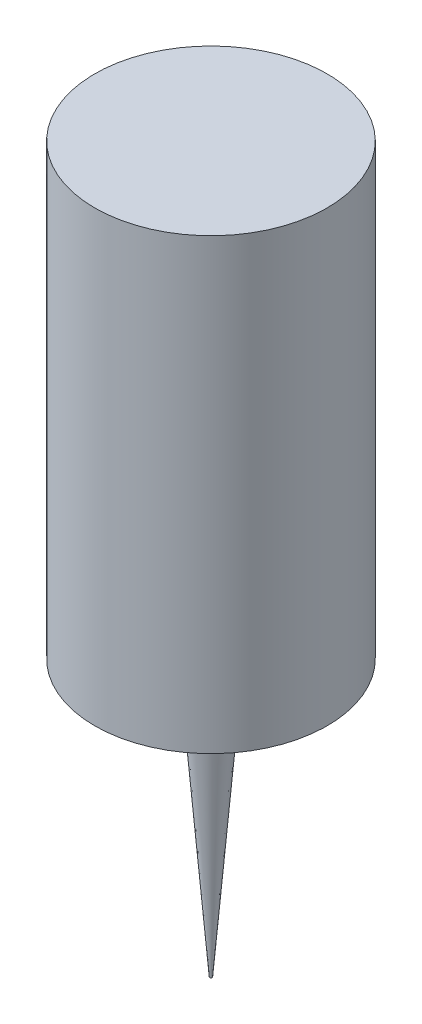
ISO-10303-21;
HEADER;
FILE_DESCRIPTION(('STEP AP214'),'2;1');
FILE_NAME('part.step','',(''),(''),'','','');
FILE_SCHEMA(('AUTOMOTIVE_DESIGN { 1 0 10303 214 1 1 1 1 }'));
ENDSEC;
DATA;
#1=APPLICATION_CONTEXT('core data for automotive mechanical design processes');
#2=APPLICATION_PROTOCOL_DEFINITION('international standard','automotive_design',2000,#1);
#3=PRODUCT_CONTEXT('',#1,'mechanical');
#4=PRODUCT('Part','Part','',(#3));
#5=PRODUCT_RELATED_PRODUCT_CATEGORY('part','',(#4));
#6=PRODUCT_DEFINITION_FORMATION('','',#4);
#7=PRODUCT_DEFINITION_CONTEXT('part definition',#1,'design');
#8=PRODUCT_DEFINITION('design','',#6,#7);
#9=PRODUCT_DEFINITION_SHAPE('','',#8);
#10=(LENGTH_UNIT() NAMED_UNIT(*) SI_UNIT(.MILLI.,.METRE.));
#11=(NAMED_UNIT(*) PLANE_ANGLE_UNIT() SI_UNIT($,.RADIAN.));
#12=(NAMED_UNIT(*) SI_UNIT($,.STERADIAN.) SOLID_ANGLE_UNIT());
#13=UNCERTAINTY_MEASURE_WITH_UNIT(LENGTH_MEASURE(1.E-05),#10,'distance_accuracy_value','');
#14=(GEOMETRIC_REPRESENTATION_CONTEXT(3) GLOBAL_UNCERTAINTY_ASSIGNED_CONTEXT((#13)) GLOBAL_UNIT_ASSIGNED_CONTEXT((#10,
#11,#12)) REPRESENTATION_CONTEXT('',''));
#15=CARTESIAN_POINT('',(0.,0.,0.));
#16=DIRECTION('',(0.,0.,1.));
#17=DIRECTION('',(1.,0.,0.));
#18=AXIS2_PLACEMENT_3D('',#15,#16,#17);
#19=CARTESIAN_POINT('',(0.,9.8044,0.));
#20=DIRECTION('',(0.,-1.,0.));
#21=DIRECTION('',(0.,0.,-1.));
#22=AXIS2_PLACEMENT_3D('',#19,#20,#21);
#23=CYLINDRICAL_SURFACE('',#22,2.54);
#24=CARTESIAN_POINT('',(0.,9.8044,0.));
#25=DIRECTION('',(0.,1.,0.));
#26=DIRECTION('',(0.,0.,1.));
#27=AXIS2_PLACEMENT_3D('',#24,#25,#26);
#28=CIRCLE('',#27,2.54);
#29=CARTESIAN_POINT('',(0.,9.8044,2.54));
#30=VERTEX_POINT('',#29);
#31=EDGE_CURVE('E10',#30,#30,#28,.T.);
#32=ORIENTED_EDGE('',*,*,#31,.F.);
#33=EDGE_LOOP('',(#32));
#34=FACE_BOUND('',#33,.T.);
#35=CARTESIAN_POINT('',(0.,0.,0.));
#36=DIRECTION('',(0.,1.,0.));
#37=DIRECTION('',(0.,0.,1.));
#38=AXIS2_PLACEMENT_3D('',#35,#36,#37);
#39=CIRCLE('',#38,2.54);
#40=CARTESIAN_POINT('',(0.,0.,2.54));
#41=VERTEX_POINT('',#40);
#42=EDGE_CURVE('E40',#41,#41,#39,.T.);
#43=ORIENTED_EDGE('',*,*,#42,.T.);
#44=EDGE_LOOP('',(#43));
#45=FACE_BOUND('',#44,.T.);
#46=ADVANCED_FACE('F37',(#34,#45),#23,.T.);
#47=CARTESIAN_POINT('',(0.,9.8044,0.));
#48=DIRECTION('',(0.,1.,0.));
#49=DIRECTION('',(0.,0.,1.));
#50=AXIS2_PLACEMENT_3D('',#47,#48,#49);
#51=PLANE('',#50);
#52=ORIENTED_EDGE('',*,*,#31,.T.);
#53=EDGE_LOOP('',(#52));
#54=FACE_BOUND('',#53,.T.);
#55=ADVANCED_FACE('F70',(#54),#51,.T.);
#56=CARTESIAN_POINT('',(0.,0.,0.));
#57=DIRECTION('',(0.,1.,0.));
#58=DIRECTION('',(0.,0.,1.));
#59=AXIS2_PLACEMENT_3D('',#56,#57,#58);
#60=PLANE('',#59);
#61=CARTESIAN_POINT('',(0.,0.,0.));
#62=DIRECTION('',(0.,1.,0.));
#63=DIRECTION('',(-1.,0.,0.));
#64=AXIS2_PLACEMENT_3D('',#61,#62,#63);
#65=CIRCLE('',#64,0.508);
#66=CARTESIAN_POINT('',(-0.508,0.,0.));
#67=VERTEX_POINT('',#66);
#68=EDGE_CURVE('E51',#67,#67,#65,.T.);
#69=ORIENTED_EDGE('',*,*,#68,.T.);
#70=EDGE_LOOP('',(#69));
#71=FACE_BOUND('',#70,.T.);
#72=ORIENTED_EDGE('',*,*,#42,.F.);
#73=EDGE_LOOP('',(#72));
#74=FACE_BOUND('',#73,.T.);
#75=ADVANCED_FACE('F55',(#71,#74),#60,.F.);
#76=CARTESIAN_POINT('',(0.,-6.02416332392541,0.));
#77=DIRECTION('',(0.,1.,0.));
#78=DIRECTION('',(-1.,0.,0.));
#79=AXIS2_PLACEMENT_3D('',#76,#77,#78);
#80=CONICAL_SURFACE('',#79,0.026066934085967,0.0798299857122373);
#81=CARTESIAN_POINT('',(0.,-6.02416332392541,0.));
#82=DIRECTION('',(0.,1.,0.));
#83=DIRECTION('',(-1.,0.,0.));
#84=AXIS2_PLACEMENT_3D('',#81,#82,#83);
#85=CIRCLE('',#84,0.026066934085967);
#86=CARTESIAN_POINT('',(-0.0260669340859662,-6.02416332392541,0.));
#87=VERTEX_POINT('',#86);
#88=EDGE_CURVE('E47',#87,#87,#85,.T.);
#89=CARTESIAN_POINT('',(-0.508,0.,0.));
#90=CARTESIAN_POINT('',(-0.502979863896729,-0.0627517012908896,0.));
#91=CARTESIAN_POINT('',(-0.497959727793458,-0.125503402581779,0.));
#92=CARTESIAN_POINT('',(-0.487919455586915,-0.251006805163559,0.));
#93=CARTESIAN_POINT('',(-0.482899319483644,-0.313758506454449,0.));
#94=CARTESIAN_POINT('',(-0.472859047277102,-0.439261909036228,0.));
#95=CARTESIAN_POINT('',(-0.467838911173831,-0.502013610327118,0.));
#96=CARTESIAN_POINT('',(-0.457798638967288,-0.627517012908897,0.));
#97=CARTESIAN_POINT('',(-0.452778502864017,-0.690268714199787,0.));
#98=CARTESIAN_POINT('',(-0.442738230657475,-0.815772116781566,0.));
#99=CARTESIAN_POINT('',(-0.437718094554203,-0.878523818072456,0.));
#100=CARTESIAN_POINT('',(-0.427677822347661,-1.00402722065424,0.));
#101=CARTESIAN_POINT('',(-0.42265768624439,-1.06677892194513,0.));
#102=CARTESIAN_POINT('',(-0.412617414037848,-1.1922823245269,0.));
#103=CARTESIAN_POINT('',(-0.407597277934576,-1.25503402581779,0.));
#104=CARTESIAN_POINT('',(-0.397557005728034,-1.38053742839957,0.));
#105=CARTESIAN_POINT('',(-0.392536869624763,-1.44328912969046,0.));
#106=CARTESIAN_POINT('',(-0.38249659741822,-1.56879253227224,0.));
#107=CARTESIAN_POINT('',(-0.377476461314949,-1.63154423356313,0.));
#108=CARTESIAN_POINT('',(-0.367436189108407,-1.75704763614491,0.));
#109=CARTESIAN_POINT('',(-0.362416053005136,-1.8197993374358,0.));
#110=CARTESIAN_POINT('',(-0.352375780798593,-1.94530274001758,0.));
#111=CARTESIAN_POINT('',(-0.347355644695322,-2.00805444130847,0.));
#112=CARTESIAN_POINT('',(-0.33731537248878,-2.13355784389025,0.));
#113=CARTESIAN_POINT('',(-0.332295236385509,-2.19630954518114,0.));
#114=CARTESIAN_POINT('',(-0.322254964178966,-2.32181294776292,0.));
#115=CARTESIAN_POINT('',(-0.317234828075695,-2.38456464905381,0.));
#116=CARTESIAN_POINT('',(-0.307194555869153,-2.51006805163559,0.));
#117=CARTESIAN_POINT('',(-0.302174419765881,-2.57281975292648,0.));
#118=CARTESIAN_POINT('',(-0.292134147559339,-2.69832315550826,0.));
#119=CARTESIAN_POINT('',(-0.287114011456068,-2.76107485679915,0.));
#120=CARTESIAN_POINT('',(-0.277073739249525,-2.88657825938093,0.));
#121=CARTESIAN_POINT('',(-0.272053603146254,-2.94932996067182,0.));
#122=CARTESIAN_POINT('',(-0.262013330939712,-3.0748333632536,0.));
#123=CARTESIAN_POINT('',(-0.256993194836441,-3.13758506454449,0.));
#124=CARTESIAN_POINT('',(-0.246952922629898,-3.26308846712627,0.));
#125=CARTESIAN_POINT('',(-0.241932786526627,-3.32584016841716,0.));
#126=CARTESIAN_POINT('',(-0.231892514320085,-3.45134357099894,0.));
#127=CARTESIAN_POINT('',(-0.226872378216814,-3.51409527228982,0.));
#128=CARTESIAN_POINT('',(-0.216832106010271,-3.6395986748716,0.));
#129=CARTESIAN_POINT('',(-0.211811969907,-3.70235037616249,0.));
#130=CARTESIAN_POINT('',(-0.201771697700458,-3.82785377874427,0.));
#131=CARTESIAN_POINT('',(-0.196751561597186,-3.89060548003516,0.));
#132=CARTESIAN_POINT('',(-0.186711289390644,-4.01610888261694,0.));
#133=CARTESIAN_POINT('',(-0.181691153287373,-4.07886058390783,0.));
#134=CARTESIAN_POINT('',(-0.171650881080831,-4.20436398648961,0.));
#135=CARTESIAN_POINT('',(-0.166630744977559,-4.2671156877805,0.));
#136=CARTESIAN_POINT('',(-0.156590472771017,-4.39261909036228,0.));
#137=CARTESIAN_POINT('',(-0.151570336667746,-4.45537079165317,0.));
#138=CARTESIAN_POINT('',(-0.141530064461203,-4.58087419423495,0.));
#139=CARTESIAN_POINT('',(-0.136509928357932,-4.64362589552584,0.));
#140=CARTESIAN_POINT('',(-0.12646965615139,-4.76912929810762,0.));
#141=CARTESIAN_POINT('',(-0.121449520048119,-4.83188099939851,0.));
#142=CARTESIAN_POINT('',(-0.111409247841576,-4.95738440198029,0.));
#143=CARTESIAN_POINT('',(-0.106389111738305,-5.02013610327118,0.));
#144=CARTESIAN_POINT('',(-0.0963488395317628,-5.14563950585296,0.));
#145=CARTESIAN_POINT('',(-0.0913287034284916,-5.20839120714385,0.));
#146=CARTESIAN_POINT('',(-0.0812884312219492,-5.33389460972563,0.));
#147=CARTESIAN_POINT('',(-0.076268295118678,-5.39664631101652,0.));
#148=CARTESIAN_POINT('',(-0.0662280229121357,-5.5221497135983,0.));
#149=CARTESIAN_POINT('',(-0.0612078868088645,-5.58490141488919,0.));
#150=CARTESIAN_POINT('',(-0.0511676146023221,-5.71040481747097,0.));
#151=CARTESIAN_POINT('',(-0.0461474784990509,-5.77315651876185,0.));
#152=CARTESIAN_POINT('',(-0.0361072062925085,-5.89865992134363,0.));
#153=CARTESIAN_POINT('',(-0.0310870701892373,-5.96141162263452,0.));
#154=CARTESIAN_POINT('',(-0.0260669340859662,-6.02416332392541,0.));
#155=B_SPLINE_CURVE_WITH_KNOTS('',3,(#89,#90,#91,#92,#93,#94,#95,#96,#97,#98,#99,#100,#101,#102,
#103,#104,#105,#106,#107,#108,#109,#110,#111,#112,#113,#114,#115,#116,#117,#118,#119,#120,#121,
#122,#123,#124,#125,#126,#127,#128,#129,#130,#131,#132,#133,#134,#135,#136,#137,#138,#139,#140,
#141,#142,#143,#144,#145,#146,#147,#148,#149,#150,#151,#152,#153,#154),.UNSPECIFIED.,.F.,.F.,(4,
2,2,2,2,2,2,2,2,2,2,2,2,2,2,2,2,2,2,2,2,2,2,2,2,2,2,2,2,2,2,2,4),(0.,0.188856559411019,
0.377713118822038,0.566569678233057,0.755426237644076,0.944282797055095,1.13313935646611,
1.32199591587713,1.51085247528815,1.69970903469917,1.88856559411019,2.07742215352121,
2.26627871293223,2.45513527234325,2.64399183175427,2.83284839116529,3.02170495057631,
3.21056150998732,3.39941806939834,3.58827462880936,3.77713118822038,3.9659877476314,
4.15484430704242,4.34370086645344,4.53255742586446,4.72141398527548,4.91027054468649,
5.09912710409751,5.28798366350853,5.47684022291955,5.66569678233057,5.85455334174159,
6.04340990115261),.UNSPECIFIED.);
#156=EDGE_CURVE('BSEAM58',#67,#87,#155,.T.);
#157=ORIENTED_EDGE('',*,*,#68,.F.);
#158=ORIENTED_EDGE('',*,*,#88,.T.);
#159=ORIENTED_EDGE('',*,*,#156,.T.);
#160=ORIENTED_EDGE('',*,*,#156,.F.);
#161=EDGE_LOOP('',(#157,#159,#158,#160));
#162=FACE_BOUND('',#161,.T.);
#163=ADVANCED_FACE('F58',(#162),#80,.T.);
#164=CARTESIAN_POINT('',(0.,-5.99114134107026,0.));
#165=DIRECTION('',(0.,1.,0.));
#166=DIRECTION('',(-1.,0.,0.));
#167=AXIS2_PLACEMENT_3D('',#164,#165,#166);
#168=SPHERICAL_SURFACE('',#167,0.0420706121220984);
#169=ORIENTED_EDGE('',*,*,#88,.F.);
#170=EDGE_LOOP('',(#169));
#171=FACE_BOUND('',#170,.T.);
#172=ADVANCED_FACE('F61',(#171),#168,.T.);
#173=CLOSED_SHELL('',(#46,#55,#75,#163,#172));
#174=MANIFOLD_SOLID_BREP('B2',#173);
#175=ADVANCED_BREP_SHAPE_REPRESENTATION('',(#18,#174),#14);
#176=SHAPE_DEFINITION_REPRESENTATION(#9,#175);
ENDSEC;
END-ISO-10303-21;
